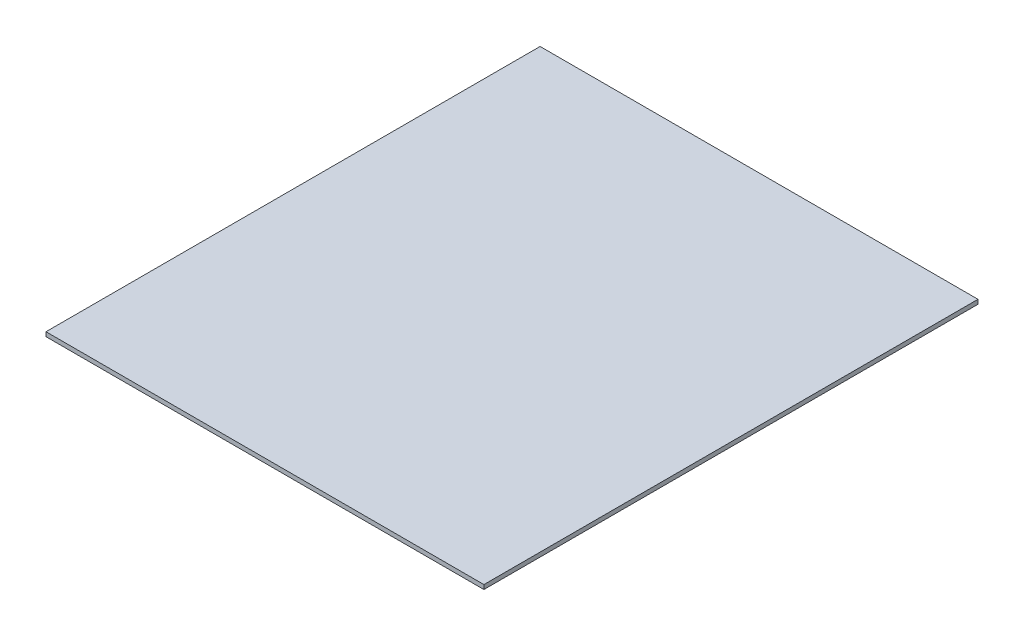
ISO-10303-21;
HEADER;
FILE_DESCRIPTION(('STEP AP214'),'2;1');
FILE_NAME('part.step','',(''),(''),'','','');
FILE_SCHEMA(('AUTOMOTIVE_DESIGN { 1 0 10303 214 1 1 1 1 }'));
ENDSEC;
DATA;
#1=APPLICATION_CONTEXT('core data for automotive mechanical design processes');
#2=APPLICATION_PROTOCOL_DEFINITION('international standard','automotive_design',2000,#1);
#3=PRODUCT_CONTEXT('',#1,'mechanical');
#4=PRODUCT('Part','Part','',(#3));
#5=PRODUCT_RELATED_PRODUCT_CATEGORY('part','',(#4));
#6=PRODUCT_DEFINITION_FORMATION('','',#4);
#7=PRODUCT_DEFINITION_CONTEXT('part definition',#1,'design');
#8=PRODUCT_DEFINITION('design','',#6,#7);
#9=PRODUCT_DEFINITION_SHAPE('','',#8);
#10=(LENGTH_UNIT() NAMED_UNIT(*) SI_UNIT(.MILLI.,.METRE.));
#11=(NAMED_UNIT(*) PLANE_ANGLE_UNIT() SI_UNIT($,.RADIAN.));
#12=(NAMED_UNIT(*) SI_UNIT($,.STERADIAN.) SOLID_ANGLE_UNIT());
#13=UNCERTAINTY_MEASURE_WITH_UNIT(LENGTH_MEASURE(1.E-05),#10,'distance_accuracy_value','');
#14=(GEOMETRIC_REPRESENTATION_CONTEXT(3) GLOBAL_UNCERTAINTY_ASSIGNED_CONTEXT((#13)) GLOBAL_UNIT_ASSIGNED_CONTEXT((#10,
#11,#12)) REPRESENTATION_CONTEXT('',''));
#15=CARTESIAN_POINT('',(0.,0.,0.));
#16=DIRECTION('',(0.,0.,1.));
#17=DIRECTION('',(1.,0.,0.));
#18=AXIS2_PLACEMENT_3D('',#15,#16,#17);
#19=CARTESIAN_POINT('',(-1325.54134500902,3.,-43.9090909090904));
#20=DIRECTION('',(-1.,0.,0.));
#21=DIRECTION('',(0.,0.,1.));
#22=AXIS2_PLACEMENT_3D('',#19,#20,#21);
#23=PLANE('',#22);
#24=DIRECTION('',(0.,0.,-1.));
#25=VECTOR('',#24,1.);
#26=CARTESIAN_POINT('',(-1325.54134500902,0.,-43.9090909090904));
#27=LINE('',#26,#25);
#28=CARTESIAN_POINT('',(-1325.54134500902,0.,-43.9090909090904));
#29=VERTEX_POINT('',#28);
#30=CARTESIAN_POINT('',(-1325.54134500902,0.,-386.90909090909));
#31=VERTEX_POINT('',#30);
#32=EDGE_CURVE('E96',#29,#31,#27,.T.);
#33=ORIENTED_EDGE('',*,*,#32,.T.);
#34=DIRECTION('',(0.,-1.,0.));
#35=VECTOR('',#34,1.);
#36=CARTESIAN_POINT('',(-1325.54134500902,3.,-386.90909090909));
#37=LINE('',#36,#35);
#38=CARTESIAN_POINT('',(-1325.54134500902,3.,-386.90909090909));
#39=VERTEX_POINT('',#38);
#40=EDGE_CURVE('E11',#39,#31,#37,.T.);
#41=ORIENTED_EDGE('',*,*,#40,.F.);
#42=DIRECTION('',(0.,0.,-1.));
#43=VECTOR('',#42,1.);
#44=CARTESIAN_POINT('',(-1325.54134500902,3.,-43.9090909090904));
#45=LINE('',#44,#43);
#46=CARTESIAN_POINT('',(-1325.54134500902,3.,-43.9090909090904));
#47=VERTEX_POINT('',#46);
#48=EDGE_CURVE('E84',#47,#39,#45,.T.);
#49=ORIENTED_EDGE('',*,*,#48,.F.);
#50=DIRECTION('',(0.,-1.,0.));
#51=VECTOR('',#50,1.);
#52=CARTESIAN_POINT('',(-1325.54134500902,3.,-43.9090909090904));
#53=LINE('',#52,#51);
#54=EDGE_CURVE('E92',#47,#29,#53,.T.);
#55=ORIENTED_EDGE('',*,*,#54,.T.);
#56=EDGE_LOOP('',(#33,#41,#49,#55));
#57=FACE_BOUND('',#56,.T.);
#58=ADVANCED_FACE('F33',(#57),#23,.F.);
#59=CARTESIAN_POINT('',(-1325.54134500902,3.,-386.90909090909));
#60=DIRECTION('',(0.,0.,1.));
#61=DIRECTION('',(1.,0.,0.));
#62=AXIS2_PLACEMENT_3D('',#59,#60,#61);
#63=PLANE('',#62);
#64=DIRECTION('',(-1.,0.,0.));
#65=VECTOR('',#64,1.);
#66=CARTESIAN_POINT('',(-1325.54134500902,0.,-386.90909090909));
#67=LINE('',#66,#65);
#68=CARTESIAN_POINT('',(-1629.54134500902,0.,-386.90909090909));
#69=VERTEX_POINT('',#68);
#70=EDGE_CURVE('E88',#31,#69,#67,.T.);
#71=ORIENTED_EDGE('',*,*,#70,.T.);
#72=DIRECTION('',(0.,-1.,0.));
#73=VECTOR('',#72,1.);
#74=CARTESIAN_POINT('',(-1629.54134500902,3.,-386.90909090909));
#75=LINE('',#74,#73);
#76=CARTESIAN_POINT('',(-1629.54134500902,3.,-386.90909090909));
#77=VERTEX_POINT('',#76);
#78=EDGE_CURVE('E41',#77,#69,#75,.T.);
#79=ORIENTED_EDGE('',*,*,#78,.F.);
#80=DIRECTION('',(-1.,0.,0.));
#81=VECTOR('',#80,1.);
#82=CARTESIAN_POINT('',(-1325.54134500902,3.,-386.90909090909));
#83=LINE('',#82,#81);
#84=EDGE_CURVE('E79',#39,#77,#83,.T.);
#85=ORIENTED_EDGE('',*,*,#84,.F.);
#86=ORIENTED_EDGE('',*,*,#40,.T.);
#87=EDGE_LOOP('',(#71,#79,#85,#86));
#88=FACE_BOUND('',#87,.T.);
#89=ADVANCED_FACE('F87',(#88),#63,.F.);
#90=CARTESIAN_POINT('',(-1629.54134500902,3.,-43.9090909090904));
#91=DIRECTION('',(1.,0.,0.));
#92=DIRECTION('',(0.,0.,-1.));
#93=AXIS2_PLACEMENT_3D('',#90,#91,#92);
#94=PLANE('',#93);
#95=DIRECTION('',(0.,0.,1.));
#96=VECTOR('',#95,1.);
#97=CARTESIAN_POINT('',(-1629.54134500902,0.,-43.9090909090904));
#98=LINE('',#97,#96);
#99=CARTESIAN_POINT('',(-1629.54134500902,0.,-43.9090909090904));
#100=VERTEX_POINT('',#99);
#101=EDGE_CURVE('E66',#69,#100,#98,.T.);
#102=ORIENTED_EDGE('',*,*,#101,.T.);
#103=DIRECTION('',(0.,-1.,0.));
#104=VECTOR('',#103,1.);
#105=CARTESIAN_POINT('',(-1629.54134500902,3.,-43.9090909090904));
#106=LINE('',#105,#104);
#107=CARTESIAN_POINT('',(-1629.54134500902,3.,-43.9090909090904));
#108=VERTEX_POINT('',#107);
#109=EDGE_CURVE('E89',#108,#100,#106,.T.);
#110=ORIENTED_EDGE('',*,*,#109,.F.);
#111=DIRECTION('',(0.,0.,1.));
#112=VECTOR('',#111,1.);
#113=CARTESIAN_POINT('',(-1629.54134500902,3.,-43.9090909090904));
#114=LINE('',#113,#112);
#115=EDGE_CURVE('E82',#77,#108,#114,.T.);
#116=ORIENTED_EDGE('',*,*,#115,.F.);
#117=ORIENTED_EDGE('',*,*,#78,.T.);
#118=EDGE_LOOP('',(#102,#110,#116,#117));
#119=FACE_BOUND('',#118,.T.);
#120=ADVANCED_FACE('F90',(#119),#94,.F.);
#121=CARTESIAN_POINT('',(-1325.54134500902,3.,-43.9090909090904));
#122=DIRECTION('',(0.,0.,-1.));
#123=DIRECTION('',(-1.,0.,0.));
#124=AXIS2_PLACEMENT_3D('',#121,#122,#123);
#125=PLANE('',#124);
#126=DIRECTION('',(1.,0.,0.));
#127=VECTOR('',#126,1.);
#128=CARTESIAN_POINT('',(-1325.54134500902,0.,-43.9090909090904));
#129=LINE('',#128,#127);
#130=EDGE_CURVE('E72',#100,#29,#129,.T.);
#131=ORIENTED_EDGE('',*,*,#130,.T.);
#132=ORIENTED_EDGE('',*,*,#54,.F.);
#133=DIRECTION('',(1.,0.,0.));
#134=VECTOR('',#133,1.);
#135=CARTESIAN_POINT('',(-1325.54134500902,3.,-43.9090909090904));
#136=LINE('',#135,#134);
#137=EDGE_CURVE('E49',#108,#47,#136,.T.);
#138=ORIENTED_EDGE('',*,*,#137,.F.);
#139=ORIENTED_EDGE('',*,*,#109,.T.);
#140=EDGE_LOOP('',(#131,#132,#138,#139));
#141=FACE_BOUND('',#140,.T.);
#142=ADVANCED_FACE('F103',(#141),#125,.F.);
#143=CARTESIAN_POINT('',(0.,3.,0.));
#144=DIRECTION('',(0.,1.,0.));
#145=DIRECTION('',(0.,0.,1.));
#146=AXIS2_PLACEMENT_3D('',#143,#144,#145);
#147=PLANE('',#146);
#148=ORIENTED_EDGE('',*,*,#48,.T.);
#149=ORIENTED_EDGE('',*,*,#84,.T.);
#150=ORIENTED_EDGE('',*,*,#115,.T.);
#151=ORIENTED_EDGE('',*,*,#137,.T.);
#152=EDGE_LOOP('',(#148,#149,#150,#151));
#153=FACE_BOUND('',#152,.T.);
#154=ADVANCED_FACE('F80',(#153),#147,.T.);
#155=CARTESIAN_POINT('',(0.,0.,0.));
#156=DIRECTION('',(0.,1.,0.));
#157=DIRECTION('',(0.,0.,1.));
#158=AXIS2_PLACEMENT_3D('',#155,#156,#157);
#159=PLANE('',#158);
#160=ORIENTED_EDGE('',*,*,#32,.F.);
#161=ORIENTED_EDGE('',*,*,#130,.F.);
#162=ORIENTED_EDGE('',*,*,#101,.F.);
#163=ORIENTED_EDGE('',*,*,#70,.F.);
#164=EDGE_LOOP('',(#160,#161,#162,#163));
#165=FACE_BOUND('',#164,.T.);
#166=ADVANCED_FACE('F106',(#165),#159,.F.);
#167=CLOSED_SHELL('',(#58,#89,#120,#142,#154,#166));
#168=MANIFOLD_SOLID_BREP('B2',#167);
#169=ADVANCED_BREP_SHAPE_REPRESENTATION('',(#18,#168),#14);
#170=SHAPE_DEFINITION_REPRESENTATION(#9,#169);
ENDSEC;
END-ISO-10303-21;
